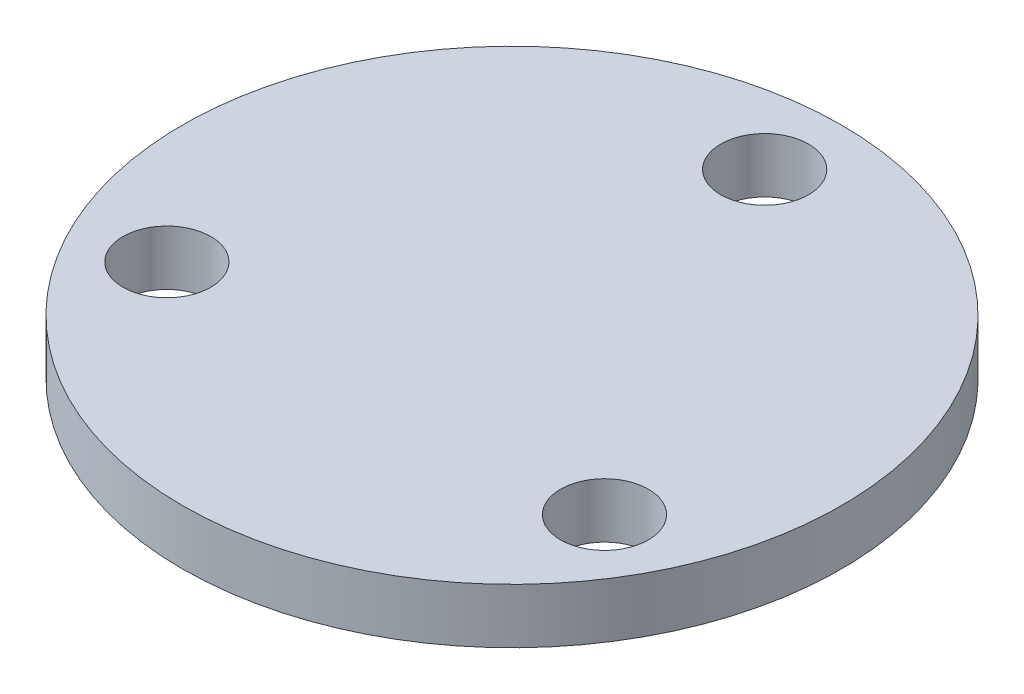
ISO-10303-21;
HEADER;
FILE_DESCRIPTION(('STEP AP214'),'2;1');
FILE_NAME('part.step','',(''),(''),'','','');
FILE_SCHEMA(('AUTOMOTIVE_DESIGN { 1 0 10303 214 1 1 1 1 }'));
ENDSEC;
DATA;
#1=APPLICATION_CONTEXT('core data for automotive mechanical design processes');
#2=APPLICATION_PROTOCOL_DEFINITION('international standard','automotive_design',2000,#1);
#3=PRODUCT_CONTEXT('',#1,'mechanical');
#4=PRODUCT('Part','Part','',(#3));
#5=PRODUCT_RELATED_PRODUCT_CATEGORY('part','',(#4));
#6=PRODUCT_DEFINITION_FORMATION('','',#4);
#7=PRODUCT_DEFINITION_CONTEXT('part definition',#1,'design');
#8=PRODUCT_DEFINITION('design','',#6,#7);
#9=PRODUCT_DEFINITION_SHAPE('','',#8);
#10=(LENGTH_UNIT() NAMED_UNIT(*) SI_UNIT(.MILLI.,.METRE.));
#11=(NAMED_UNIT(*) PLANE_ANGLE_UNIT() SI_UNIT($,.RADIAN.));
#12=(NAMED_UNIT(*) SI_UNIT($,.STERADIAN.) SOLID_ANGLE_UNIT());
#13=UNCERTAINTY_MEASURE_WITH_UNIT(LENGTH_MEASURE(1.E-05),#10,'distance_accuracy_value','');
#14=(GEOMETRIC_REPRESENTATION_CONTEXT(3) GLOBAL_UNCERTAINTY_ASSIGNED_CONTEXT((#13)) GLOBAL_UNIT_ASSIGNED_CONTEXT((#10,
#11,#12)) REPRESENTATION_CONTEXT('',''));
#15=CARTESIAN_POINT('',(0.,0.,0.));
#16=DIRECTION('',(0.,0.,1.));
#17=DIRECTION('',(1.,0.,0.));
#18=AXIS2_PLACEMENT_3D('',#15,#16,#17);
#19=CARTESIAN_POINT('',(0.,5.,0.));
#20=DIRECTION('',(0.,1.,0.));
#21=DIRECTION('',(0.,0.,1.));
#22=AXIS2_PLACEMENT_3D('',#19,#20,#21);
#23=PLANE('',#22);
#24=CARTESIAN_POINT('',(19.9185842870436,5.,11.4999999999991));
#25=DIRECTION('',(0.,1.,0.));
#26=DIRECTION('',(0.,0.,1.));
#27=AXIS2_PLACEMENT_3D('',#24,#25,#26);
#28=CIRCLE('',#27,4.);
#29=CARTESIAN_POINT('',(19.9185842870436,5.,15.4999999999991));
#30=VERTEX_POINT('',#29);
#31=EDGE_CURVE('E48',#30,#30,#28,.T.);
#32=ORIENTED_EDGE('',*,*,#31,.F.);
#33=EDGE_LOOP('',(#32));
#34=FACE_BOUND('',#33,.T.);
#35=CARTESIAN_POINT('',(0.,5.,0.));
#36=DIRECTION('',(0.,1.,0.));
#37=DIRECTION('',(0.,0.,1.));
#38=AXIS2_PLACEMENT_3D('',#35,#36,#37);
#39=CIRCLE('',#38,30.);
#40=CARTESIAN_POINT('',(0.,5.,30.));
#41=VERTEX_POINT('',#40);
#42=EDGE_CURVE('E10',#41,#41,#39,.T.);
#43=ORIENTED_EDGE('',*,*,#42,.T.);
#44=EDGE_LOOP('',(#43));
#45=FACE_BOUND('',#44,.T.);
#46=CARTESIAN_POINT('',(0.,5.,-23.));
#47=DIRECTION('',(0.,1.,0.));
#48=DIRECTION('',(0.,0.,1.));
#49=AXIS2_PLACEMENT_3D('',#46,#47,#48);
#50=CIRCLE('',#49,4.);
#51=CARTESIAN_POINT('',(0.,5.,-19.));
#52=VERTEX_POINT('',#51);
#53=EDGE_CURVE('E43',#52,#52,#50,.T.);
#54=ORIENTED_EDGE('',*,*,#53,.F.);
#55=EDGE_LOOP('',(#54));
#56=FACE_BOUND('',#55,.T.);
#57=CARTESIAN_POINT('',(-19.9185842870406,5.,11.5000000000009));
#58=DIRECTION('',(0.,1.,0.));
#59=DIRECTION('',(0.,0.,1.));
#60=AXIS2_PLACEMENT_3D('',#57,#58,#59);
#61=CIRCLE('',#60,4.);
#62=CARTESIAN_POINT('',(-19.9185842870406,5.,15.5000000000009));
#63=VERTEX_POINT('',#62);
#64=EDGE_CURVE('E54',#63,#63,#61,.T.);
#65=ORIENTED_EDGE('',*,*,#64,.F.);
#66=EDGE_LOOP('',(#65));
#67=FACE_BOUND('',#66,.T.);
#68=ADVANCED_FACE('F32',(#34,#45,#56,#67),#23,.T.);
#69=CARTESIAN_POINT('',(0.,0.,0.));
#70=DIRECTION('',(0.,1.,0.));
#71=DIRECTION('',(0.,0.,1.));
#72=AXIS2_PLACEMENT_3D('',#69,#70,#71);
#73=PLANE('',#72);
#74=CARTESIAN_POINT('',(0.,0.,0.));
#75=DIRECTION('',(0.,1.,0.));
#76=DIRECTION('',(0.,0.,1.));
#77=AXIS2_PLACEMENT_3D('',#74,#75,#76);
#78=CIRCLE('',#77,30.);
#79=CARTESIAN_POINT('',(0.,0.,30.));
#80=VERTEX_POINT('',#79);
#81=EDGE_CURVE('E36',#80,#80,#78,.T.);
#82=ORIENTED_EDGE('',*,*,#81,.F.);
#83=EDGE_LOOP('',(#82));
#84=FACE_BOUND('',#83,.T.);
#85=CARTESIAN_POINT('',(0.,0.,-23.));
#86=DIRECTION('',(0.,1.,0.));
#87=DIRECTION('',(0.,0.,1.));
#88=AXIS2_PLACEMENT_3D('',#85,#86,#87);
#89=CIRCLE('',#88,4.);
#90=CARTESIAN_POINT('',(0.,0.,-19.));
#91=VERTEX_POINT('',#90);
#92=EDGE_CURVE('E45',#91,#91,#89,.T.);
#93=ORIENTED_EDGE('',*,*,#92,.T.);
#94=EDGE_LOOP('',(#93));
#95=FACE_BOUND('',#94,.T.);
#96=CARTESIAN_POINT('',(19.9185842870436,0.,11.4999999999991));
#97=DIRECTION('',(0.,1.,0.));
#98=DIRECTION('',(0.,0.,1.));
#99=AXIS2_PLACEMENT_3D('',#96,#97,#98);
#100=CIRCLE('',#99,4.);
#101=CARTESIAN_POINT('',(19.9185842870436,0.,15.4999999999991));
#102=VERTEX_POINT('',#101);
#103=EDGE_CURVE('E51',#102,#102,#100,.T.);
#104=ORIENTED_EDGE('',*,*,#103,.T.);
#105=EDGE_LOOP('',(#104));
#106=FACE_BOUND('',#105,.T.);
#107=CARTESIAN_POINT('',(-19.9185842870406,0.,11.5000000000009));
#108=DIRECTION('',(0.,1.,0.));
#109=DIRECTION('',(0.,0.,1.));
#110=AXIS2_PLACEMENT_3D('',#107,#108,#109);
#111=CIRCLE('',#110,4.);
#112=CARTESIAN_POINT('',(-19.9185842870406,0.,15.5000000000009));
#113=VERTEX_POINT('',#112);
#114=EDGE_CURVE('E57',#113,#113,#111,.T.);
#115=ORIENTED_EDGE('',*,*,#114,.T.);
#116=EDGE_LOOP('',(#115));
#117=FACE_BOUND('',#116,.T.);
#118=ADVANCED_FACE('F67',(#84,#95,#106,#117),#73,.F.);
#119=CARTESIAN_POINT('',(0.,5.,0.));
#120=DIRECTION('',(0.,-1.,0.));
#121=DIRECTION('',(0.,0.,-1.));
#122=AXIS2_PLACEMENT_3D('',#119,#120,#121);
#123=CYLINDRICAL_SURFACE('',#122,30.);
#124=ORIENTED_EDGE('',*,*,#42,.F.);
#125=EDGE_LOOP('',(#124));
#126=FACE_BOUND('',#125,.T.);
#127=ORIENTED_EDGE('',*,*,#81,.T.);
#128=EDGE_LOOP('',(#127));
#129=FACE_BOUND('',#128,.T.);
#130=ADVANCED_FACE('F34',(#126,#129),#123,.T.);
#131=CARTESIAN_POINT('',(0.,5.,-23.));
#132=DIRECTION('',(0.,-1.,0.));
#133=DIRECTION('',(0.,0.,-1.));
#134=AXIS2_PLACEMENT_3D('',#131,#132,#133);
#135=CYLINDRICAL_SURFACE('',#134,4.);
#136=ORIENTED_EDGE('',*,*,#53,.T.);
#137=EDGE_LOOP('',(#136));
#138=FACE_BOUND('',#137,.T.);
#139=ORIENTED_EDGE('',*,*,#92,.F.);
#140=EDGE_LOOP('',(#139));
#141=FACE_BOUND('',#140,.T.);
#142=ADVANCED_FACE('F76',(#138,#141),#135,.F.);
#143=CARTESIAN_POINT('',(19.9185842870436,5.,11.4999999999991));
#144=DIRECTION('',(0.,-1.,0.));
#145=DIRECTION('',(0.,0.,-1.));
#146=AXIS2_PLACEMENT_3D('',#143,#144,#145);
#147=CYLINDRICAL_SURFACE('',#146,4.);
#148=ORIENTED_EDGE('',*,*,#31,.T.);
#149=EDGE_LOOP('',(#148));
#150=FACE_BOUND('',#149,.T.);
#151=ORIENTED_EDGE('',*,*,#103,.F.);
#152=EDGE_LOOP('',(#151));
#153=FACE_BOUND('',#152,.T.);
#154=ADVANCED_FACE('F79',(#150,#153),#147,.F.);
#155=CARTESIAN_POINT('',(-19.9185842870406,5.,11.5000000000009));
#156=DIRECTION('',(0.,-1.,0.));
#157=DIRECTION('',(0.,0.,-1.));
#158=AXIS2_PLACEMENT_3D('',#155,#156,#157);
#159=CYLINDRICAL_SURFACE('',#158,4.);
#160=ORIENTED_EDGE('',*,*,#64,.T.);
#161=EDGE_LOOP('',(#160));
#162=FACE_BOUND('',#161,.T.);
#163=ORIENTED_EDGE('',*,*,#114,.F.);
#164=EDGE_LOOP('',(#163));
#165=FACE_BOUND('',#164,.T.);
#166=ADVANCED_FACE('F63',(#162,#165),#159,.F.);
#167=CLOSED_SHELL('',(#68,#118,#130,#142,#154,#166));
#168=MANIFOLD_SOLID_BREP('B2',#167);
#169=ADVANCED_BREP_SHAPE_REPRESENTATION('',(#18,#168),#14);
#170=SHAPE_DEFINITION_REPRESENTATION(#9,#169);
ENDSEC;
END-ISO-10303-21;
